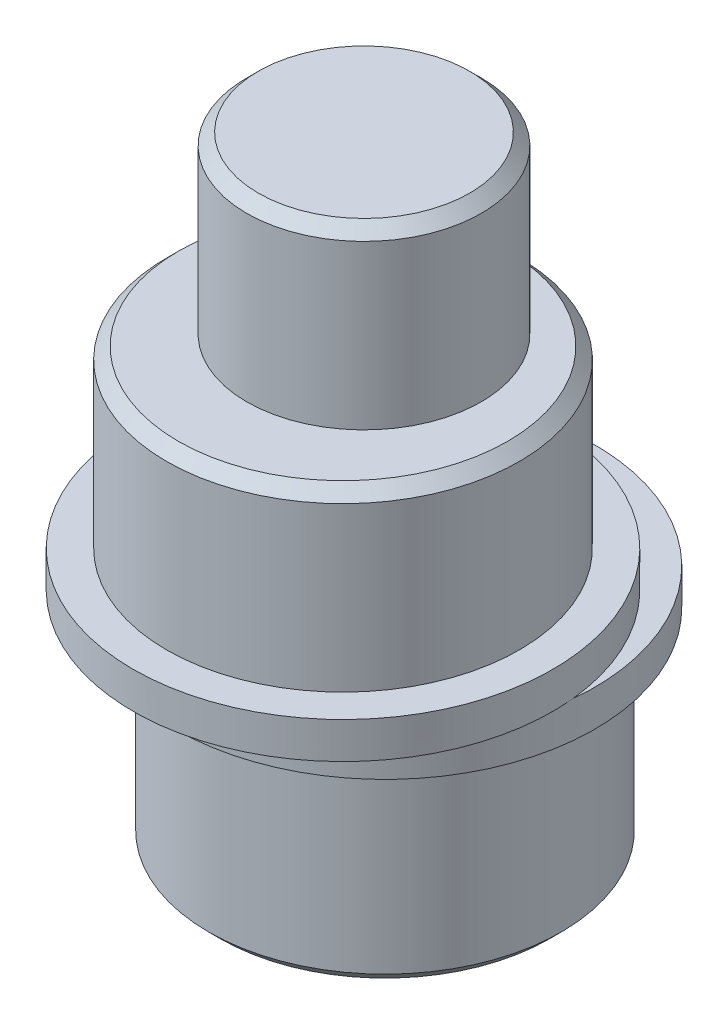
ISO-10303-21;
HEADER;
FILE_DESCRIPTION(('STEP AP214'),'2;1');
FILE_NAME('part.step','',(''),(''),'','','');
FILE_SCHEMA(('AUTOMOTIVE_DESIGN { 1 0 10303 214 1 1 1 1 }'));
ENDSEC;
DATA;
#1=APPLICATION_CONTEXT('core data for automotive mechanical design processes');
#2=APPLICATION_PROTOCOL_DEFINITION('international standard','automotive_design',2000,#1);
#3=PRODUCT_CONTEXT('',#1,'mechanical');
#4=PRODUCT('Part','Part','',(#3));
#5=PRODUCT_RELATED_PRODUCT_CATEGORY('part','',(#4));
#6=PRODUCT_DEFINITION_FORMATION('','',#4);
#7=PRODUCT_DEFINITION_CONTEXT('part definition',#1,'design');
#8=PRODUCT_DEFINITION('design','',#6,#7);
#9=PRODUCT_DEFINITION_SHAPE('','',#8);
#10=(LENGTH_UNIT() NAMED_UNIT(*) SI_UNIT(.MILLI.,.METRE.));
#11=(NAMED_UNIT(*) PLANE_ANGLE_UNIT() SI_UNIT($,.RADIAN.));
#12=(NAMED_UNIT(*) SI_UNIT($,.STERADIAN.) SOLID_ANGLE_UNIT());
#13=UNCERTAINTY_MEASURE_WITH_UNIT(LENGTH_MEASURE(1.E-05),#10,'distance_accuracy_value','');
#14=(GEOMETRIC_REPRESENTATION_CONTEXT(3) GLOBAL_UNCERTAINTY_ASSIGNED_CONTEXT((#13)) GLOBAL_UNIT_ASSIGNED_CONTEXT((#10,
#11,#12)) REPRESENTATION_CONTEXT('',''));
#15=CARTESIAN_POINT('',(0.,0.,0.));
#16=DIRECTION('',(0.,0.,1.));
#17=DIRECTION('',(1.,0.,0.));
#18=AXIS2_PLACEMENT_3D('',#15,#16,#17);
#19=CARTESIAN_POINT('',(0.,7.,-0.72));
#20=DIRECTION('',(0.,-1.,0.));
#21=DIRECTION('',(0.,0.,-1.));
#22=AXIS2_PLACEMENT_3D('',#19,#20,#21);
#23=CYLINDRICAL_SURFACE('',#22,6.05);
#24=CARTESIAN_POINT('',(0.,0.399999999999998,-0.72));
#25=DIRECTION('',(0.,1.,0.));
#26=DIRECTION('',(0.,0.,1.));
#27=AXIS2_PLACEMENT_3D('',#24,#25,#26);
#28=CIRCLE('',#27,6.05);
#29=CARTESIAN_POINT('',(0.,0.399999999999998,5.33));
#30=VERTEX_POINT('',#29);
#31=EDGE_CURVE('E52',#30,#30,#28,.T.);
#32=ORIENTED_EDGE('',*,*,#31,.T.);
#33=EDGE_LOOP('',(#32));
#34=FACE_BOUND('',#33,.T.);
#35=CARTESIAN_POINT('',(0.,7.,-0.72));
#36=DIRECTION('',(0.,1.,0.));
#37=DIRECTION('',(0.,0.,1.));
#38=AXIS2_PLACEMENT_3D('',#35,#36,#37);
#39=CIRCLE('',#38,6.05);
#40=CARTESIAN_POINT('',(0.,7.,5.33));
#41=VERTEX_POINT('',#40);
#42=EDGE_CURVE('E96',#41,#41,#39,.T.);
#43=ORIENTED_EDGE('',*,*,#42,.F.);
#44=EDGE_LOOP('',(#43));
#45=FACE_BOUND('',#44,.T.);
#46=ADVANCED_FACE('F43',(#34,#45),#23,.T.);
#47=CARTESIAN_POINT('',(0.,0.,-0.72));
#48=DIRECTION('',(0.,1.,0.));
#49=DIRECTION('',(0.,0.,1.));
#50=AXIS2_PLACEMENT_3D('',#47,#48,#49);
#51=PLANE('',#50);
#52=CARTESIAN_POINT('',(0.,0.,-0.72));
#53=DIRECTION('',(0.,1.,0.));
#54=DIRECTION('',(0.,0.,1.));
#55=AXIS2_PLACEMENT_3D('',#52,#53,#54);
#56=CIRCLE('',#55,5.65);
#57=CARTESIAN_POINT('',(0.,0.,4.93));
#58=VERTEX_POINT('',#57);
#59=EDGE_CURVE('E11',#58,#58,#56,.F.);
#60=ORIENTED_EDGE('',*,*,#59,.T.);
#61=EDGE_LOOP('',(#60));
#62=FACE_BOUND('',#61,.T.);
#63=DIRECTION('',(1.,0.,0.));
#64=VECTOR('',#63,1.);
#65=CARTESIAN_POINT('',(0.,0.,2.15));
#66=LINE('',#65,#64);
#67=CARTESIAN_POINT('',(-1.5060295481829,0.,2.15));
#68=VERTEX_POINT('',#67);
#69=CARTESIAN_POINT('',(1.5060295481829,0.,2.15));
#70=VERTEX_POINT('',#69);
#71=EDGE_CURVE('E97',#68,#70,#66,.T.);
#72=ORIENTED_EDGE('',*,*,#71,.T.);
#73=CARTESIAN_POINT('',(0.,0.,0.));
#74=DIRECTION('',(0.,-1.,0.));
#75=DIRECTION('',(0.,0.,-1.));
#76=AXIS2_PLACEMENT_3D('',#73,#74,#75);
#77=CIRCLE('',#76,2.625);
#78=EDGE_CURVE('E78',#70,#68,#77,.F.);
#79=ORIENTED_EDGE('',*,*,#78,.T.);
#80=EDGE_LOOP('',(#72,#79));
#81=FACE_BOUND('',#80,.T.);
#82=ADVANCED_FACE('F145',(#62,#81),#51,.F.);
#83=CARTESIAN_POINT('',(0.,8.25,-0.72));
#84=DIRECTION('',(0.,-1.,0.));
#85=DIRECTION('',(0.,0.,-1.));
#86=AXIS2_PLACEMENT_3D('',#83,#84,#85);
#87=CYLINDRICAL_SURFACE('',#86,7.2);
#88=CARTESIAN_POINT('',(0.,8.25,-0.72));
#89=DIRECTION('',(0.,1.,0.));
#90=DIRECTION('',(0.,0.,1.));
#91=AXIS2_PLACEMENT_3D('',#88,#89,#90);
#92=CIRCLE('',#91,7.2);
#93=CARTESIAN_POINT('',(7.16390954716766,8.25,0.));
#94=VERTEX_POINT('',#93);
#95=CARTESIAN_POINT('',(-7.16390954716766,8.25,0.));
#96=VERTEX_POINT('',#95);
#97=EDGE_CURVE('E106',#94,#96,#92,.T.);
#98=ORIENTED_EDGE('',*,*,#97,.F.);
#99=EDGE_CURVE('E108',#96,#94,#92,.T.);
#100=ORIENTED_EDGE('',*,*,#99,.F.);
#101=EDGE_LOOP('',(#98,#100));
#102=FACE_BOUND('',#101,.T.);
#103=CARTESIAN_POINT('',(0.,7.,-0.72));
#104=DIRECTION('',(0.,1.,0.));
#105=DIRECTION('',(0.,0.,1.));
#106=AXIS2_PLACEMENT_3D('',#103,#104,#105);
#107=CIRCLE('',#106,7.2);
#108=CARTESIAN_POINT('',(0.,7.,6.48));
#109=VERTEX_POINT('',#108);
#110=EDGE_CURVE('E105',#109,#109,#107,.T.);
#111=ORIENTED_EDGE('',*,*,#110,.T.);
#112=EDGE_LOOP('',(#111));
#113=FACE_BOUND('',#112,.T.);
#114=ADVANCED_FACE('F150',(#102,#113),#87,.T.);
#115=CARTESIAN_POINT('',(0.,8.25,-0.72));
#116=DIRECTION('',(0.,1.,0.));
#117=DIRECTION('',(0.,0.,1.));
#118=AXIS2_PLACEMENT_3D('',#115,#116,#117);
#119=PLANE('',#118);
#120=CARTESIAN_POINT('',(0.,8.25,0.72));
#121=DIRECTION('',(0.,1.,0.));
#122=DIRECTION('',(0.,0.,1.));
#123=AXIS2_PLACEMENT_3D('',#120,#121,#122);
#124=CIRCLE('',#123,7.2);
#125=EDGE_CURVE('E101',#94,#96,#124,.T.);
#126=ORIENTED_EDGE('',*,*,#125,.F.);
#127=ORIENTED_EDGE('',*,*,#97,.T.);
#128=EDGE_LOOP('',(#126,#127));
#129=FACE_BOUND('',#128,.T.);
#130=ADVANCED_FACE('F207',(#129),#119,.T.);
#131=CARTESIAN_POINT('',(0.,7.,-0.72));
#132=DIRECTION('',(0.,1.,0.));
#133=DIRECTION('',(0.,0.,1.));
#134=AXIS2_PLACEMENT_3D('',#131,#132,#133);
#135=PLANE('',#134);
#136=ORIENTED_EDGE('',*,*,#42,.T.);
#137=EDGE_LOOP('',(#136));
#138=FACE_BOUND('',#137,.T.);
#139=ORIENTED_EDGE('',*,*,#110,.F.);
#140=EDGE_LOOP('',(#139));
#141=FACE_BOUND('',#140,.T.);
#142=ADVANCED_FACE('F201',(#138,#141),#135,.F.);
#143=CARTESIAN_POINT('',(0.,8.25,0.72));
#144=DIRECTION('',(0.,1.,0.));
#145=DIRECTION('',(0.,0.,1.));
#146=AXIS2_PLACEMENT_3D('',#143,#144,#145);
#147=PLANE('',#146);
#148=EDGE_CURVE('E93',#96,#94,#124,.T.);
#149=ORIENTED_EDGE('',*,*,#148,.F.);
#150=ORIENTED_EDGE('',*,*,#99,.T.);
#151=EDGE_LOOP('',(#149,#150));
#152=FACE_BOUND('',#151,.T.);
#153=ADVANCED_FACE('F196',(#152),#147,.F.);
#154=CARTESIAN_POINT('',(0.,9.5,0.72));
#155=DIRECTION('',(0.,-1.,0.));
#156=DIRECTION('',(0.,0.,-1.));
#157=AXIS2_PLACEMENT_3D('',#154,#155,#156);
#158=CYLINDRICAL_SURFACE('',#157,7.2);
#159=CARTESIAN_POINT('',(0.,9.5,0.72));
#160=DIRECTION('',(0.,1.,0.));
#161=DIRECTION('',(0.,0.,1.));
#162=AXIS2_PLACEMENT_3D('',#159,#160,#161);
#163=CIRCLE('',#162,7.2);
#164=CARTESIAN_POINT('',(0.,9.5,7.92));
#165=VERTEX_POINT('',#164);
#166=EDGE_CURVE('E100',#165,#165,#163,.T.);
#167=ORIENTED_EDGE('',*,*,#166,.F.);
#168=EDGE_LOOP('',(#167));
#169=FACE_BOUND('',#168,.T.);
#170=ORIENTED_EDGE('',*,*,#125,.T.);
#171=ORIENTED_EDGE('',*,*,#148,.T.);
#172=EDGE_LOOP('',(#170,#171));
#173=FACE_BOUND('',#172,.T.);
#174=ADVANCED_FACE('F198',(#169,#173),#158,.T.);
#175=CARTESIAN_POINT('',(0.,9.5,0.72));
#176=DIRECTION('',(0.,1.,0.));
#177=DIRECTION('',(0.,0.,1.));
#178=AXIS2_PLACEMENT_3D('',#175,#176,#177);
#179=PLANE('',#178);
#180=CARTESIAN_POINT('',(0.,9.5,0.72));
#181=DIRECTION('',(0.,1.,0.));
#182=DIRECTION('',(0.,0.,1.));
#183=AXIS2_PLACEMENT_3D('',#180,#181,#182);
#184=CIRCLE('',#183,6.05);
#185=CARTESIAN_POINT('',(0.,9.5,6.77));
#186=VERTEX_POINT('',#185);
#187=EDGE_CURVE('E92',#186,#186,#184,.T.);
#188=ORIENTED_EDGE('',*,*,#187,.F.);
#189=EDGE_LOOP('',(#188));
#190=FACE_BOUND('',#189,.T.);
#191=ORIENTED_EDGE('',*,*,#166,.T.);
#192=EDGE_LOOP('',(#191));
#193=FACE_BOUND('',#192,.T.);
#194=ADVANCED_FACE('F186',(#190,#193),#179,.T.);
#195=CARTESIAN_POINT('',(0.,15.5,0.72));
#196=DIRECTION('',(0.,-1.,0.));
#197=DIRECTION('',(0.,0.,-1.));
#198=AXIS2_PLACEMENT_3D('',#195,#196,#197);
#199=CYLINDRICAL_SURFACE('',#198,6.05);
#200=CARTESIAN_POINT('',(0.,15.1,0.72));
#201=DIRECTION('',(0.,1.,0.));
#202=DIRECTION('',(0.,0.,1.));
#203=AXIS2_PLACEMENT_3D('',#200,#201,#202);
#204=CIRCLE('',#203,6.05);
#205=CARTESIAN_POINT('',(0.,15.1,6.77));
#206=VERTEX_POINT('',#205);
#207=EDGE_CURVE('E123',#206,#206,#204,.F.);
#208=ORIENTED_EDGE('',*,*,#207,.T.);
#209=EDGE_LOOP('',(#208));
#210=FACE_BOUND('',#209,.T.);
#211=ORIENTED_EDGE('',*,*,#187,.T.);
#212=EDGE_LOOP('',(#211));
#213=FACE_BOUND('',#212,.T.);
#214=ADVANCED_FACE('F181',(#210,#213),#199,.T.);
#215=CARTESIAN_POINT('',(0.,15.5,0.72));
#216=DIRECTION('',(0.,1.,0.));
#217=DIRECTION('',(0.,0.,1.));
#218=AXIS2_PLACEMENT_3D('',#215,#216,#217);
#219=PLANE('',#218);
#220=CARTESIAN_POINT('',(0.,15.5,0.72));
#221=DIRECTION('',(0.,1.,0.));
#222=DIRECTION('',(0.,0.,1.));
#223=AXIS2_PLACEMENT_3D('',#220,#221,#222);
#224=CIRCLE('',#223,5.65);
#225=CARTESIAN_POINT('',(0.,15.5,6.37));
#226=VERTEX_POINT('',#225);
#227=EDGE_CURVE('E125',#226,#226,#224,.T.);
#228=ORIENTED_EDGE('',*,*,#227,.T.);
#229=EDGE_LOOP('',(#228));
#230=FACE_BOUND('',#229,.T.);
#231=CARTESIAN_POINT('',(0.,15.5,0.));
#232=DIRECTION('',(0.,1.,0.));
#233=DIRECTION('',(0.,0.,1.));
#234=AXIS2_PLACEMENT_3D('',#231,#232,#233);
#235=CIRCLE('',#234,4.025);
#236=CARTESIAN_POINT('',(0.,15.5,4.025));
#237=VERTEX_POINT('',#236);
#238=EDGE_CURVE('E114',#237,#237,#235,.T.);
#239=ORIENTED_EDGE('',*,*,#238,.F.);
#240=EDGE_LOOP('',(#239));
#241=FACE_BOUND('',#240,.T.);
#242=ADVANCED_FACE('F177',(#230,#241),#219,.T.);
#243=CARTESIAN_POINT('',(0.,11.,0.));
#244=DIRECTION('',(0.,-1.,0.));
#245=DIRECTION('',(0.,0.,-1.));
#246=AXIS2_PLACEMENT_3D('',#243,#244,#245);
#247=CYLINDRICAL_SURFACE('',#246,2.625);
#248=DIRECTION('',(0.,-1.,0.));
#249=VECTOR('',#248,1.);
#250=CARTESIAN_POINT('',(1.5060295481829,11.,2.15));
#251=LINE('',#250,#249);
#252=CARTESIAN_POINT('',(1.5060295481829,11.,2.15));
#253=VERTEX_POINT('',#252);
#254=EDGE_CURVE('E58',#253,#70,#251,.T.);
#255=ORIENTED_EDGE('',*,*,#254,.F.);
#256=CARTESIAN_POINT('',(0.,11.,0.));
#257=DIRECTION('',(0.,-1.,0.));
#258=DIRECTION('',(0.,0.,-1.));
#259=AXIS2_PLACEMENT_3D('',#256,#257,#258);
#260=CIRCLE('',#259,2.625);
#261=CARTESIAN_POINT('',(-1.5060295481829,11.,2.15));
#262=VERTEX_POINT('',#261);
#263=EDGE_CURVE('E80',#262,#253,#260,.T.);
#264=ORIENTED_EDGE('',*,*,#263,.F.);
#265=DIRECTION('',(0.,-1.,0.));
#266=VECTOR('',#265,1.);
#267=CARTESIAN_POINT('',(-1.5060295481829,11.,2.15));
#268=LINE('',#267,#266);
#269=EDGE_CURVE('E81',#262,#68,#268,.T.);
#270=ORIENTED_EDGE('',*,*,#269,.T.);
#271=ORIENTED_EDGE('',*,*,#78,.F.);
#272=EDGE_LOOP('',(#255,#264,#270,#271));
#273=FACE_BOUND('',#272,.T.);
#274=ADVANCED_FACE('F74',(#273),#247,.F.);
#275=CARTESIAN_POINT('',(1.5060295481829,11.,2.15));
#276=DIRECTION('',(0.,0.,1.));
#277=DIRECTION('',(1.,0.,0.));
#278=AXIS2_PLACEMENT_3D('',#275,#276,#277);
#279=PLANE('',#278);
#280=ORIENTED_EDGE('',*,*,#269,.F.);
#281=DIRECTION('',(-1.,0.,0.));
#282=VECTOR('',#281,1.);
#283=CARTESIAN_POINT('',(1.5060295481829,11.,2.15));
#284=LINE('',#283,#282);
#285=EDGE_CURVE('E85',#253,#262,#284,.T.);
#286=ORIENTED_EDGE('',*,*,#285,.F.);
#287=ORIENTED_EDGE('',*,*,#254,.T.);
#288=ORIENTED_EDGE('',*,*,#71,.F.);
#289=EDGE_LOOP('',(#280,#286,#287,#288));
#290=FACE_BOUND('',#289,.T.);
#291=ADVANCED_FACE('F86',(#290),#279,.F.);
#292=CARTESIAN_POINT('',(0.,11.,0.));
#293=DIRECTION('',(0.,-1.,0.));
#294=DIRECTION('',(0.,0.,-1.));
#295=AXIS2_PLACEMENT_3D('',#292,#293,#294);
#296=PLANE('',#295);
#297=ORIENTED_EDGE('',*,*,#263,.T.);
#298=ORIENTED_EDGE('',*,*,#285,.T.);
#299=EDGE_LOOP('',(#297,#298));
#300=FACE_BOUND('',#299,.T.);
#301=ADVANCED_FACE('F88',(#300),#296,.T.);
#302=CARTESIAN_POINT('',(0.,21.5,0.));
#303=DIRECTION('',(0.,-1.,0.));
#304=DIRECTION('',(0.,0.,-1.));
#305=AXIS2_PLACEMENT_3D('',#302,#303,#304);
#306=CYLINDRICAL_SURFACE('',#305,4.025);
#307=CARTESIAN_POINT('',(0.,21.1,0.));
#308=DIRECTION('',(0.,1.,0.));
#309=DIRECTION('',(0.,0.,1.));
#310=AXIS2_PLACEMENT_3D('',#307,#308,#309);
#311=CIRCLE('',#310,4.025);
#312=CARTESIAN_POINT('',(0.,21.1,4.025));
#313=VERTEX_POINT('',#312);
#314=EDGE_CURVE('E118',#313,#313,#311,.F.);
#315=ORIENTED_EDGE('',*,*,#314,.T.);
#316=EDGE_LOOP('',(#315));
#317=FACE_BOUND('',#316,.T.);
#318=ORIENTED_EDGE('',*,*,#238,.T.);
#319=EDGE_LOOP('',(#318));
#320=FACE_BOUND('',#319,.T.);
#321=ADVANCED_FACE('F168',(#317,#320),#306,.T.);
#322=CARTESIAN_POINT('',(0.,21.5,0.));
#323=DIRECTION('',(0.,1.,0.));
#324=DIRECTION('',(0.,0.,1.));
#325=AXIS2_PLACEMENT_3D('',#322,#323,#324);
#326=PLANE('',#325);
#327=CARTESIAN_POINT('',(0.,21.5,0.));
#328=DIRECTION('',(0.,1.,0.));
#329=DIRECTION('',(0.,0.,1.));
#330=AXIS2_PLACEMENT_3D('',#327,#328,#329);
#331=CIRCLE('',#330,3.62499999999999);
#332=CARTESIAN_POINT('',(0.,21.5,3.62499999999999));
#333=VERTEX_POINT('',#332);
#334=EDGE_CURVE('E116',#333,#333,#331,.T.);
#335=ORIENTED_EDGE('',*,*,#334,.T.);
#336=EDGE_LOOP('',(#335));
#337=FACE_BOUND('',#336,.T.);
#338=ADVANCED_FACE('F160',(#337),#326,.T.);
#339=CARTESIAN_POINT('',(0.,21.5,0.));
#340=DIRECTION('',(0.,-1.,0.));
#341=DIRECTION('',(0.,0.,-1.));
#342=AXIS2_PLACEMENT_3D('',#339,#340,#341);
#343=CONICAL_SURFACE('',#342,3.62499999999999,0.785398163397443);
#344=ORIENTED_EDGE('',*,*,#314,.F.);
#345=EDGE_LOOP('',(#344));
#346=FACE_BOUND('',#345,.T.);
#347=ORIENTED_EDGE('',*,*,#334,.F.);
#348=EDGE_LOOP('',(#347));
#349=FACE_BOUND('',#348,.T.);
#350=ADVANCED_FACE('F138',(#346,#349),#343,.T.);
#351=CARTESIAN_POINT('',(0.,15.5,0.72));
#352=DIRECTION('',(0.,-1.,0.));
#353=DIRECTION('',(0.,0.,-1.));
#354=AXIS2_PLACEMENT_3D('',#351,#352,#353);
#355=CONICAL_SURFACE('',#354,5.65,0.785398163397446);
#356=ORIENTED_EDGE('',*,*,#207,.F.);
#357=EDGE_LOOP('',(#356));
#358=FACE_BOUND('',#357,.T.);
#359=ORIENTED_EDGE('',*,*,#227,.F.);
#360=EDGE_LOOP('',(#359));
#361=FACE_BOUND('',#360,.T.);
#362=ADVANCED_FACE('F131',(#358,#361),#355,.T.);
#363=CARTESIAN_POINT('',(0.,0.399999999999998,-0.72));
#364=DIRECTION('',(0.,1.,0.));
#365=DIRECTION('',(0.,0.,1.));
#366=AXIS2_PLACEMENT_3D('',#363,#364,#365);
#367=CONICAL_SURFACE('',#366,6.05,0.785398163397448);
#368=ORIENTED_EDGE('',*,*,#59,.F.);
#369=EDGE_LOOP('',(#368));
#370=FACE_BOUND('',#369,.T.);
#371=ORIENTED_EDGE('',*,*,#31,.F.);
#372=EDGE_LOOP('',(#371));
#373=FACE_BOUND('',#372,.T.);
#374=ADVANCED_FACE('F46',(#370,#373),#367,.T.);
#375=CLOSED_SHELL('',(#46,#82,#114,#130,#142,#153,#174,#194,#214,#242,#274,#291,#301,#321,#338,
#350,#362,#374));
#376=MANIFOLD_SOLID_BREP('B2',#375);
#377=ADVANCED_BREP_SHAPE_REPRESENTATION('',(#18,#376),#14);
#378=SHAPE_DEFINITION_REPRESENTATION(#9,#377);
ENDSEC;
END-ISO-10303-21;
